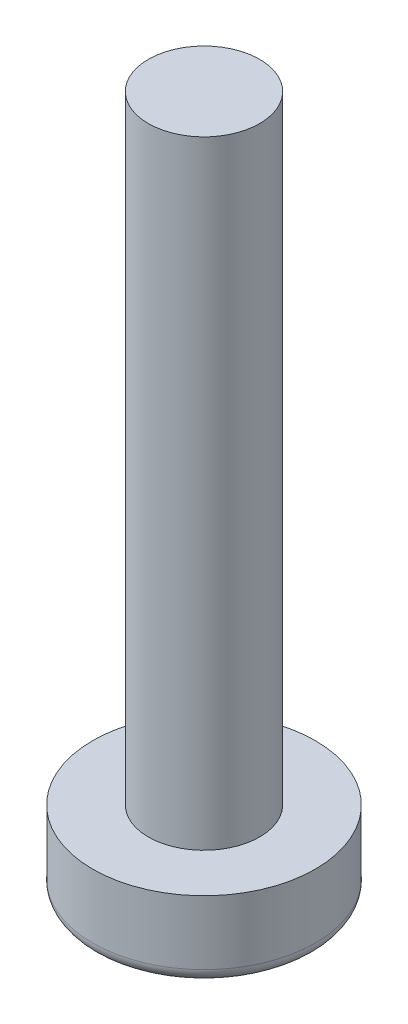
ISO-10303-21;
HEADER;
FILE_DESCRIPTION(('STEP AP214'),'2;1');
FILE_NAME('part.step','',(''),(''),'','','');
FILE_SCHEMA(('AUTOMOTIVE_DESIGN { 1 0 10303 214 1 1 1 1 }'));
ENDSEC;
DATA;
#1=APPLICATION_CONTEXT('core data for automotive mechanical design processes');
#2=APPLICATION_PROTOCOL_DEFINITION('international standard','automotive_design',2000,#1);
#3=PRODUCT_CONTEXT('',#1,'mechanical');
#4=PRODUCT('Part','Part','',(#3));
#5=PRODUCT_RELATED_PRODUCT_CATEGORY('part','',(#4));
#6=PRODUCT_DEFINITION_FORMATION('','',#4);
#7=PRODUCT_DEFINITION_CONTEXT('part definition',#1,'design');
#8=PRODUCT_DEFINITION('design','',#6,#7);
#9=PRODUCT_DEFINITION_SHAPE('','',#8);
#10=(LENGTH_UNIT() NAMED_UNIT(*) SI_UNIT(.MILLI.,.METRE.));
#11=(NAMED_UNIT(*) PLANE_ANGLE_UNIT() SI_UNIT($,.RADIAN.));
#12=(NAMED_UNIT(*) SI_UNIT($,.STERADIAN.) SOLID_ANGLE_UNIT());
#13=UNCERTAINTY_MEASURE_WITH_UNIT(LENGTH_MEASURE(1.E-05),#10,'distance_accuracy_value','');
#14=(GEOMETRIC_REPRESENTATION_CONTEXT(3) GLOBAL_UNCERTAINTY_ASSIGNED_CONTEXT((#13)) GLOBAL_UNIT_ASSIGNED_CONTEXT((#10,
#11,#12)) REPRESENTATION_CONTEXT('',''));
#15=CARTESIAN_POINT('',(0.,0.,0.));
#16=DIRECTION('',(0.,0.,1.));
#17=DIRECTION('',(1.,0.,0.));
#18=AXIS2_PLACEMENT_3D('',#15,#16,#17);
#19=CARTESIAN_POINT('',(0.,2.8,0.));
#20=DIRECTION('',(0.,-1.,0.));
#21=DIRECTION('',(0.,0.,-1.));
#22=AXIS2_PLACEMENT_3D('',#19,#20,#21);
#23=CYLINDRICAL_SURFACE('',#22,4.);
#24=CARTESIAN_POINT('',(0.,0.5,0.));
#25=DIRECTION('',(0.,1.,0.));
#26=DIRECTION('',(0.,0.,1.));
#27=AXIS2_PLACEMENT_3D('',#24,#25,#26);
#28=CIRCLE('',#27,4.);
#29=CARTESIAN_POINT('',(0.,0.5,4.));
#30=VERTEX_POINT('',#29);
#31=EDGE_CURVE('E42',#30,#30,#28,.T.);
#32=ORIENTED_EDGE('',*,*,#31,.T.);
#33=EDGE_LOOP('',(#32));
#34=FACE_BOUND('',#33,.T.);
#35=CARTESIAN_POINT('',(0.,2.8,0.));
#36=DIRECTION('',(0.,1.,0.));
#37=DIRECTION('',(0.,0.,1.));
#38=AXIS2_PLACEMENT_3D('',#35,#36,#37);
#39=CIRCLE('',#38,4.);
#40=CARTESIAN_POINT('',(0.,2.8,4.));
#41=VERTEX_POINT('',#40);
#42=EDGE_CURVE('E46',#41,#41,#39,.T.);
#43=ORIENTED_EDGE('',*,*,#42,.F.);
#44=EDGE_LOOP('',(#43));
#45=FACE_BOUND('',#44,.T.);
#46=ADVANCED_FACE('F35',(#34,#45),#23,.T.);
#47=CARTESIAN_POINT('',(0.,2.8,0.));
#48=DIRECTION('',(0.,1.,0.));
#49=DIRECTION('',(0.,0.,1.));
#50=AXIS2_PLACEMENT_3D('',#47,#48,#49);
#51=PLANE('',#50);
#52=CARTESIAN_POINT('',(0.,2.8,0.));
#53=DIRECTION('',(0.,1.,0.));
#54=DIRECTION('',(0.,0.,1.));
#55=AXIS2_PLACEMENT_3D('',#52,#53,#54);
#56=CIRCLE('',#55,2.);
#57=CARTESIAN_POINT('',(0.,2.8,2.));
#58=VERTEX_POINT('',#57);
#59=EDGE_CURVE('E50',#58,#58,#56,.F.);
#60=ORIENTED_EDGE('',*,*,#59,.T.);
#61=EDGE_LOOP('',(#60));
#62=FACE_BOUND('',#61,.T.);
#63=ORIENTED_EDGE('',*,*,#42,.T.);
#64=EDGE_LOOP('',(#63));
#65=FACE_BOUND('',#64,.T.);
#66=ADVANCED_FACE('F71',(#62,#65),#51,.T.);
#67=CARTESIAN_POINT('',(0.,0.,0.));
#68=DIRECTION('',(0.,1.,0.));
#69=DIRECTION('',(0.,0.,1.));
#70=AXIS2_PLACEMENT_3D('',#67,#68,#69);
#71=PLANE('',#70);
#72=CARTESIAN_POINT('',(0.,0.,0.));
#73=DIRECTION('',(0.,1.,0.));
#74=DIRECTION('',(0.,0.,1.));
#75=AXIS2_PLACEMENT_3D('',#72,#73,#74);
#76=CIRCLE('',#75,3.5);
#77=CARTESIAN_POINT('',(0.,0.,3.5));
#78=VERTEX_POINT('',#77);
#79=EDGE_CURVE('E10',#78,#78,#76,.F.);
#80=ORIENTED_EDGE('',*,*,#79,.T.);
#81=EDGE_LOOP('',(#80));
#82=FACE_BOUND('',#81,.T.);
#83=ADVANCED_FACE('F63',(#82),#71,.F.);
#84=CARTESIAN_POINT('',(0.,25.,0.));
#85=DIRECTION('',(0.,-1.,0.));
#86=DIRECTION('',(0.,0.,-1.));
#87=AXIS2_PLACEMENT_3D('',#84,#85,#86);
#88=CYLINDRICAL_SURFACE('',#87,2.);
#89=ORIENTED_EDGE('',*,*,#59,.F.);
#90=EDGE_LOOP('',(#89));
#91=FACE_BOUND('',#90,.T.);
#92=CARTESIAN_POINT('',(0.,25.,0.));
#93=DIRECTION('',(0.,1.,0.));
#94=DIRECTION('',(0.,0.,1.));
#95=AXIS2_PLACEMENT_3D('',#92,#93,#94);
#96=CIRCLE('',#95,2.);
#97=CARTESIAN_POINT('',(0.,25.,2.));
#98=VERTEX_POINT('',#97);
#99=EDGE_CURVE('E55',#98,#98,#96,.T.);
#100=ORIENTED_EDGE('',*,*,#99,.F.);
#101=EDGE_LOOP('',(#100));
#102=FACE_BOUND('',#101,.T.);
#103=ADVANCED_FACE('F61',(#91,#102),#88,.T.);
#104=CARTESIAN_POINT('',(0.,25.,0.));
#105=DIRECTION('',(0.,1.,0.));
#106=DIRECTION('',(0.,0.,1.));
#107=AXIS2_PLACEMENT_3D('',#104,#105,#106);
#108=PLANE('',#107);
#109=ORIENTED_EDGE('',*,*,#99,.T.);
#110=EDGE_LOOP('',(#109));
#111=FACE_BOUND('',#110,.T.);
#112=ADVANCED_FACE('F59',(#111),#108,.T.);
#113=CARTESIAN_POINT('',(0.,0.5,0.));
#114=DIRECTION('',(0.,1.,0.));
#115=DIRECTION('',(0.,0.,1.));
#116=AXIS2_PLACEMENT_3D('',#113,#114,#115);
#117=TOROIDAL_SURFACE('',#116,3.5,0.5);
#118=ORIENTED_EDGE('',*,*,#79,.F.);
#119=EDGE_LOOP('',(#118));
#120=FACE_BOUND('',#119,.T.);
#121=ORIENTED_EDGE('',*,*,#31,.F.);
#122=EDGE_LOOP('',(#121));
#123=FACE_BOUND('',#122,.T.);
#124=ADVANCED_FACE('F37',(#120,#123),#117,.T.);
#125=CLOSED_SHELL('',(#46,#66,#83,#103,#112,#124));
#126=MANIFOLD_SOLID_BREP('B2',#125);
#127=ADVANCED_BREP_SHAPE_REPRESENTATION('',(#18,#126),#14);
#128=SHAPE_DEFINITION_REPRESENTATION(#9,#127);
ENDSEC;
END-ISO-10303-21;
